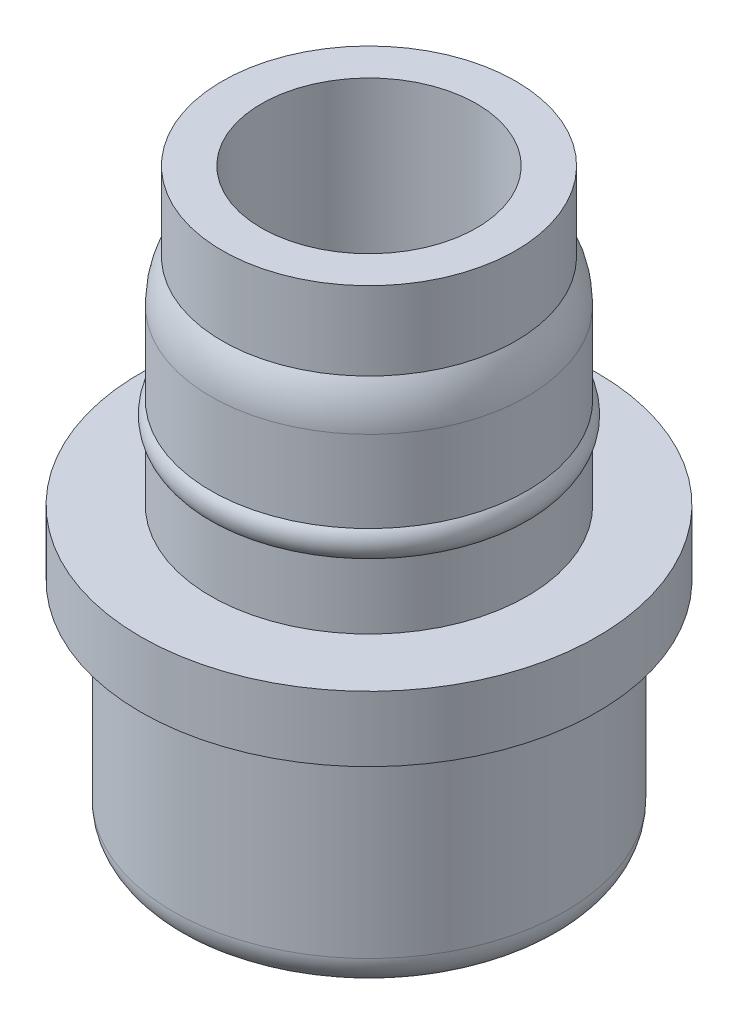
ISO-10303-21;
HEADER;
FILE_DESCRIPTION(('STEP AP214'),'2;1');
FILE_NAME('part.step','',(''),(''),'','','');
FILE_SCHEMA(('AUTOMOTIVE_DESIGN { 1 0 10303 214 1 1 1 1 }'));
ENDSEC;
DATA;
#1=APPLICATION_CONTEXT('core data for automotive mechanical design processes');
#2=APPLICATION_PROTOCOL_DEFINITION('international standard','automotive_design',2000,#1);
#3=PRODUCT_CONTEXT('',#1,'mechanical');
#4=PRODUCT('Part','Part','',(#3));
#5=PRODUCT_RELATED_PRODUCT_CATEGORY('part','',(#4));
#6=PRODUCT_DEFINITION_FORMATION('','',#4);
#7=PRODUCT_DEFINITION_CONTEXT('part definition',#1,'design');
#8=PRODUCT_DEFINITION('design','',#6,#7);
#9=PRODUCT_DEFINITION_SHAPE('','',#8);
#10=(LENGTH_UNIT() NAMED_UNIT(*) SI_UNIT(.MILLI.,.METRE.));
#11=(NAMED_UNIT(*) PLANE_ANGLE_UNIT() SI_UNIT($,.RADIAN.));
#12=(NAMED_UNIT(*) SI_UNIT($,.STERADIAN.) SOLID_ANGLE_UNIT());
#13=UNCERTAINTY_MEASURE_WITH_UNIT(LENGTH_MEASURE(1.E-05),#10,'distance_accuracy_value','');
#14=(GEOMETRIC_REPRESENTATION_CONTEXT(3) GLOBAL_UNCERTAINTY_ASSIGNED_CONTEXT((#13)) GLOBAL_UNIT_ASSIGNED_CONTEXT((#10,
#11,#12)) REPRESENTATION_CONTEXT('',''));
#15=CARTESIAN_POINT('',(0.,0.,0.));
#16=DIRECTION('',(0.,0.,1.));
#17=DIRECTION('',(1.,0.,0.));
#18=AXIS2_PLACEMENT_3D('',#15,#16,#17);
#19=CARTESIAN_POINT('',(0.,0.,0.));
#20=DIRECTION('',(0.,-1.,0.));
#21=DIRECTION('',(-1.,0.,0.));
#22=AXIS2_PLACEMENT_3D('',#19,#20,#21);
#23=SPHERICAL_SURFACE('',#22,4.5);
#24=CARTESIAN_POINT('',(0.,-1.9,0.));
#25=DIRECTION('',(0.,-1.,0.));
#26=DIRECTION('',(0.,0.,-1.));
#27=AXIS2_PLACEMENT_3D('',#24,#25,#26);
#28=CIRCLE('',#27,4.07921561087423);
#29=CARTESIAN_POINT('',(0.,-1.9,-4.07921561087423));
#30=VERTEX_POINT('',#29);
#31=EDGE_CURVE('E10',#30,#30,#28,.T.);
#32=ORIENTED_EDGE('',*,*,#31,.T.);
#33=EDGE_LOOP('',(#32));
#34=FACE_BOUND('',#33,.T.);
#35=ADVANCED_FACE('F31',(#34),#23,.T.);
#36=CARTESIAN_POINT('',(4.07921561087423,-1.9,0.));
#37=DIRECTION('',(0.,-1.,0.));
#38=DIRECTION('',(0.,0.,-1.));
#39=AXIS2_PLACEMENT_3D('',#36,#37,#38);
#40=PLANE('',#39);
#41=CARTESIAN_POINT('',(0.,-1.9,0.));
#42=DIRECTION('',(0.,-1.,0.));
#43=DIRECTION('',(0.,0.,-1.));
#44=AXIS2_PLACEMENT_3D('',#41,#42,#43);
#45=CIRCLE('',#44,5.);
#46=CARTESIAN_POINT('',(0.,-1.9,-5.));
#47=VERTEX_POINT('',#46);
#48=EDGE_CURVE('E37',#47,#47,#45,.T.);
#49=ORIENTED_EDGE('',*,*,#48,.T.);
#50=EDGE_LOOP('',(#49));
#51=FACE_BOUND('',#50,.T.);
#52=ORIENTED_EDGE('',*,*,#31,.F.);
#53=EDGE_LOOP('',(#52));
#54=FACE_BOUND('',#53,.T.);
#55=ADVANCED_FACE('F96',(#51,#54),#40,.T.);
#56=CARTESIAN_POINT('',(0.,-0.900000000000002,0.));
#57=DIRECTION('',(0.,-1.,0.));
#58=DIRECTION('',(0.,0.,-1.));
#59=AXIS2_PLACEMENT_3D('',#56,#57,#58);
#60=TOROIDAL_SURFACE('',#59,5.,1.);
#61=CARTESIAN_POINT('',(0.,-0.900000000000002,0.));
#62=DIRECTION('',(0.,-1.,0.));
#63=DIRECTION('',(0.,0.,-1.));
#64=AXIS2_PLACEMENT_3D('',#61,#62,#63);
#65=CIRCLE('',#64,6.);
#66=CARTESIAN_POINT('',(0.,-0.900000000000002,-6.));
#67=VERTEX_POINT('',#66);
#68=EDGE_CURVE('E41',#67,#67,#65,.T.);
#69=ORIENTED_EDGE('',*,*,#68,.T.);
#70=EDGE_LOOP('',(#69));
#71=FACE_BOUND('',#70,.T.);
#72=ORIENTED_EDGE('',*,*,#48,.F.);
#73=EDGE_LOOP('',(#72));
#74=FACE_BOUND('',#73,.T.);
#75=ADVANCED_FACE('F100',(#71,#74),#60,.T.);
#76=CARTESIAN_POINT('',(0.,0.,0.));
#77=DIRECTION('',(0.,-1.,0.));
#78=DIRECTION('',(0.,0.,-1.));
#79=AXIS2_PLACEMENT_3D('',#76,#77,#78);
#80=CYLINDRICAL_SURFACE('',#79,6.);
#81=CARTESIAN_POINT('',(0.,4.9,0.));
#82=DIRECTION('',(0.,-1.,0.));
#83=DIRECTION('',(0.,0.,-1.));
#84=AXIS2_PLACEMENT_3D('',#81,#82,#83);
#85=CIRCLE('',#84,6.);
#86=CARTESIAN_POINT('',(0.,4.9,-6.));
#87=VERTEX_POINT('',#86);
#88=EDGE_CURVE('E45',#87,#87,#85,.T.);
#89=ORIENTED_EDGE('',*,*,#88,.T.);
#90=EDGE_LOOP('',(#89));
#91=FACE_BOUND('',#90,.T.);
#92=ORIENTED_EDGE('',*,*,#68,.F.);
#93=EDGE_LOOP('',(#92));
#94=FACE_BOUND('',#93,.T.);
#95=ADVANCED_FACE('F104',(#91,#94),#80,.T.);
#96=CARTESIAN_POINT('',(6.,4.9,0.));
#97=DIRECTION('',(0.,-1.,0.));
#98=DIRECTION('',(0.,0.,-1.));
#99=AXIS2_PLACEMENT_3D('',#96,#97,#98);
#100=PLANE('',#99);
#101=CARTESIAN_POINT('',(0.,4.9,0.));
#102=DIRECTION('',(0.,-1.,0.));
#103=DIRECTION('',(0.,0.,-1.));
#104=AXIS2_PLACEMENT_3D('',#101,#102,#103);
#105=CIRCLE('',#104,7.);
#106=CARTESIAN_POINT('',(0.,4.9,-7.));
#107=VERTEX_POINT('',#106);
#108=EDGE_CURVE('E50',#107,#107,#105,.T.);
#109=ORIENTED_EDGE('',*,*,#108,.T.);
#110=EDGE_LOOP('',(#109));
#111=FACE_BOUND('',#110,.T.);
#112=ORIENTED_EDGE('',*,*,#88,.F.);
#113=EDGE_LOOP('',(#112));
#114=FACE_BOUND('',#113,.T.);
#115=ADVANCED_FACE('F111',(#111,#114),#100,.T.);
#116=CARTESIAN_POINT('',(0.,0.,0.));
#117=DIRECTION('',(0.,-1.,0.));
#118=DIRECTION('',(0.,0.,-1.));
#119=AXIS2_PLACEMENT_3D('',#116,#117,#118);
#120=CYLINDRICAL_SURFACE('',#119,7.);
#121=CARTESIAN_POINT('',(0.,6.9,0.));
#122=DIRECTION('',(0.,-1.,0.));
#123=DIRECTION('',(0.,0.,-1.));
#124=AXIS2_PLACEMENT_3D('',#121,#122,#123);
#125=CIRCLE('',#124,7.);
#126=CARTESIAN_POINT('',(0.,6.9,-7.));
#127=VERTEX_POINT('',#126);
#128=EDGE_CURVE('E53',#127,#127,#125,.T.);
#129=ORIENTED_EDGE('',*,*,#128,.T.);
#130=EDGE_LOOP('',(#129));
#131=FACE_BOUND('',#130,.T.);
#132=ORIENTED_EDGE('',*,*,#108,.F.);
#133=EDGE_LOOP('',(#132));
#134=FACE_BOUND('',#133,.T.);
#135=ADVANCED_FACE('F115',(#131,#134),#120,.T.);
#136=CARTESIAN_POINT('',(7.,6.9,0.));
#137=DIRECTION('',(0.,1.,0.));
#138=DIRECTION('',(0.,0.,1.));
#139=AXIS2_PLACEMENT_3D('',#136,#137,#138);
#140=PLANE('',#139);
#141=CARTESIAN_POINT('',(0.,6.9,0.));
#142=DIRECTION('',(0.,-1.,0.));
#143=DIRECTION('',(0.,0.,-1.));
#144=AXIS2_PLACEMENT_3D('',#141,#142,#143);
#145=CIRCLE('',#144,4.85);
#146=CARTESIAN_POINT('',(0.,6.9,-4.85));
#147=VERTEX_POINT('',#146);
#148=EDGE_CURVE('E56',#147,#147,#145,.T.);
#149=ORIENTED_EDGE('',*,*,#148,.T.);
#150=EDGE_LOOP('',(#149));
#151=FACE_BOUND('',#150,.T.);
#152=ORIENTED_EDGE('',*,*,#128,.F.);
#153=EDGE_LOOP('',(#152));
#154=FACE_BOUND('',#153,.T.);
#155=ADVANCED_FACE('F119',(#151,#154),#140,.T.);
#156=CARTESIAN_POINT('',(0.,0.,0.));
#157=DIRECTION('',(0.,-1.,0.));
#158=DIRECTION('',(0.,0.,-1.));
#159=AXIS2_PLACEMENT_3D('',#156,#157,#158);
#160=CYLINDRICAL_SURFACE('',#159,4.85);
#161=CARTESIAN_POINT('',(0.,8.9,0.));
#162=DIRECTION('',(0.,-1.,0.));
#163=DIRECTION('',(0.,0.,-1.));
#164=AXIS2_PLACEMENT_3D('',#161,#162,#163);
#165=CIRCLE('',#164,4.85);
#166=CARTESIAN_POINT('',(0.,8.9,-4.85));
#167=VERTEX_POINT('',#166);
#168=EDGE_CURVE('E59',#167,#167,#165,.T.);
#169=ORIENTED_EDGE('',*,*,#168,.T.);
#170=EDGE_LOOP('',(#169));
#171=FACE_BOUND('',#170,.T.);
#172=ORIENTED_EDGE('',*,*,#148,.F.);
#173=EDGE_LOOP('',(#172));
#174=FACE_BOUND('',#173,.T.);
#175=ADVANCED_FACE('F123',(#171,#174),#160,.T.);
#176=CARTESIAN_POINT('',(0.,9.3,0.));
#177=DIRECTION('',(0.,-1.,0.));
#178=DIRECTION('',(0.,0.,-1.));
#179=AXIS2_PLACEMENT_3D('',#176,#177,#178);
#180=TOROIDAL_SURFACE('',#179,4.39166666666667,0.608333333333334);
#181=CARTESIAN_POINT('',(0.,9.7,0.));
#182=DIRECTION('',(0.,-1.,0.));
#183=DIRECTION('',(0.,0.,-1.));
#184=AXIS2_PLACEMENT_3D('',#181,#182,#183);
#185=CIRCLE('',#184,4.85);
#186=CARTESIAN_POINT('',(0.,9.7,-4.85));
#187=VERTEX_POINT('',#186);
#188=EDGE_CURVE('E62',#187,#187,#185,.T.);
#189=ORIENTED_EDGE('',*,*,#188,.T.);
#190=EDGE_LOOP('',(#189));
#191=FACE_BOUND('',#190,.T.);
#192=ORIENTED_EDGE('',*,*,#168,.F.);
#193=EDGE_LOOP('',(#192));
#194=FACE_BOUND('',#193,.T.);
#195=ADVANCED_FACE('F127',(#191,#194),#180,.T.);
#196=CARTESIAN_POINT('',(0.,0.,0.));
#197=DIRECTION('',(0.,-1.,0.));
#198=DIRECTION('',(0.,0.,-1.));
#199=AXIS2_PLACEMENT_3D('',#196,#197,#198);
#200=CYLINDRICAL_SURFACE('',#199,4.85);
#201=CARTESIAN_POINT('',(0.,12.2,0.));
#202=DIRECTION('',(0.,-1.,0.));
#203=DIRECTION('',(0.,0.,-1.));
#204=AXIS2_PLACEMENT_3D('',#201,#202,#203);
#205=CIRCLE('',#204,4.85);
#206=CARTESIAN_POINT('',(0.,12.2,-4.85));
#207=VERTEX_POINT('',#206);
#208=EDGE_CURVE('E65',#207,#207,#205,.T.);
#209=ORIENTED_EDGE('',*,*,#208,.T.);
#210=EDGE_LOOP('',(#209));
#211=FACE_BOUND('',#210,.T.);
#212=ORIENTED_EDGE('',*,*,#188,.F.);
#213=EDGE_LOOP('',(#212));
#214=FACE_BOUND('',#213,.T.);
#215=ADVANCED_FACE('F131',(#211,#214),#200,.T.);
#216=CARTESIAN_POINT('',(0.,12.2,0.));
#217=DIRECTION('',(0.,-1.,0.));
#218=DIRECTION('',(0.,0.,-1.));
#219=AXIS2_PLACEMENT_3D('',#216,#217,#218);
#220=DEGENERATE_TOROIDAL_SURFACE('',#219,2.26071428571429,2.58928571428571,.T.);
#221=CARTESIAN_POINT('',(0.,13.5,0.));
#222=DIRECTION('',(0.,-1.,0.));
#223=DIRECTION('',(0.,0.,-1.));
#224=AXIS2_PLACEMENT_3D('',#221,#222,#223);
#225=CIRCLE('',#224,4.5);
#226=CARTESIAN_POINT('',(0.,13.5,-4.5));
#227=VERTEX_POINT('',#226);
#228=EDGE_CURVE('E68',#227,#227,#225,.T.);
#229=ORIENTED_EDGE('',*,*,#228,.T.);
#230=EDGE_LOOP('',(#229));
#231=FACE_BOUND('',#230,.T.);
#232=ORIENTED_EDGE('',*,*,#208,.F.);
#233=EDGE_LOOP('',(#232));
#234=FACE_BOUND('',#233,.T.);
#235=ADVANCED_FACE('F135',(#231,#234),#220,.T.);
#236=CARTESIAN_POINT('',(0.,0.,0.));
#237=DIRECTION('',(0.,-1.,0.));
#238=DIRECTION('',(0.,0.,-1.));
#239=AXIS2_PLACEMENT_3D('',#236,#237,#238);
#240=CYLINDRICAL_SURFACE('',#239,4.5);
#241=CARTESIAN_POINT('',(0.,15.9,0.));
#242=DIRECTION('',(0.,-1.,0.));
#243=DIRECTION('',(0.,0.,-1.));
#244=AXIS2_PLACEMENT_3D('',#241,#242,#243);
#245=CIRCLE('',#244,4.5);
#246=CARTESIAN_POINT('',(0.,15.9,-4.5));
#247=VERTEX_POINT('',#246);
#248=EDGE_CURVE('E71',#247,#247,#245,.T.);
#249=ORIENTED_EDGE('',*,*,#248,.T.);
#250=EDGE_LOOP('',(#249));
#251=FACE_BOUND('',#250,.T.);
#252=ORIENTED_EDGE('',*,*,#228,.F.);
#253=EDGE_LOOP('',(#252));
#254=FACE_BOUND('',#253,.T.);
#255=ADVANCED_FACE('F139',(#251,#254),#240,.T.);
#256=CARTESIAN_POINT('',(4.5,15.9,0.));
#257=DIRECTION('',(0.,1.,0.));
#258=DIRECTION('',(0.,0.,1.));
#259=AXIS2_PLACEMENT_3D('',#256,#257,#258);
#260=PLANE('',#259);
#261=CARTESIAN_POINT('',(0.,15.9,0.));
#262=DIRECTION('',(0.,-1.,0.));
#263=DIRECTION('',(0.,0.,-1.));
#264=AXIS2_PLACEMENT_3D('',#261,#262,#263);
#265=CIRCLE('',#264,3.3);
#266=CARTESIAN_POINT('',(0.,15.9,-3.3));
#267=VERTEX_POINT('',#266);
#268=EDGE_CURVE('E74',#267,#267,#265,.T.);
#269=ORIENTED_EDGE('',*,*,#268,.T.);
#270=EDGE_LOOP('',(#269));
#271=FACE_BOUND('',#270,.T.);
#272=ORIENTED_EDGE('',*,*,#248,.F.);
#273=EDGE_LOOP('',(#272));
#274=FACE_BOUND('',#273,.T.);
#275=ADVANCED_FACE('F143',(#271,#274),#260,.T.);
#276=CARTESIAN_POINT('',(0.,0.,0.));
#277=DIRECTION('',(0.,-1.,0.));
#278=DIRECTION('',(0.,0.,-1.));
#279=AXIS2_PLACEMENT_3D('',#276,#277,#278);
#280=CYLINDRICAL_SURFACE('',#279,3.3);
#281=CARTESIAN_POINT('',(0.,4.2,0.));
#282=DIRECTION('',(0.,-1.,0.));
#283=DIRECTION('',(0.,0.,-1.));
#284=AXIS2_PLACEMENT_3D('',#281,#282,#283);
#285=CIRCLE('',#284,3.3);
#286=CARTESIAN_POINT('',(0.,4.2,-3.3));
#287=VERTEX_POINT('',#286);
#288=EDGE_CURVE('E77',#287,#287,#285,.T.);
#289=ORIENTED_EDGE('',*,*,#288,.T.);
#290=EDGE_LOOP('',(#289));
#291=FACE_BOUND('',#290,.T.);
#292=ORIENTED_EDGE('',*,*,#268,.F.);
#293=EDGE_LOOP('',(#292));
#294=FACE_BOUND('',#293,.T.);
#295=ADVANCED_FACE('F93',(#291,#294),#280,.F.);
#296=CARTESIAN_POINT('',(1.61554944214036,4.2,0.));
#297=DIRECTION('',(0.,1.,0.));
#298=DIRECTION('',(0.,0.,1.));
#299=AXIS2_PLACEMENT_3D('',#296,#297,#298);
#300=PLANE('',#299);
#301=CARTESIAN_POINT('',(0.,4.2,0.));
#302=DIRECTION('',(0.,-1.,0.));
#303=DIRECTION('',(0.,0.,-1.));
#304=AXIS2_PLACEMENT_3D('',#301,#302,#303);
#305=CIRCLE('',#304,1.61554944214036);
#306=CARTESIAN_POINT('',(0.,4.2,-1.61554944214036));
#307=VERTEX_POINT('',#306);
#308=EDGE_CURVE('E80',#307,#307,#305,.T.);
#309=ORIENTED_EDGE('',*,*,#308,.T.);
#310=EDGE_LOOP('',(#309));
#311=FACE_BOUND('',#310,.T.);
#312=ORIENTED_EDGE('',*,*,#288,.F.);
#313=EDGE_LOOP('',(#312));
#314=FACE_BOUND('',#313,.T.);
#315=ADVANCED_FACE('F84',(#311,#314),#300,.T.);
#316=CARTESIAN_POINT('',(0.,0.,0.));
#317=DIRECTION('',(0.,-1.,0.));
#318=DIRECTION('',(1.,0.,0.));
#319=AXIS2_PLACEMENT_3D('',#316,#317,#318);
#320=SPHERICAL_SURFACE('',#319,4.5);
#321=ORIENTED_EDGE('',*,*,#308,.F.);
#322=EDGE_LOOP('',(#321));
#323=FACE_BOUND('',#322,.T.);
#324=ADVANCED_FACE('F87',(#323),#320,.T.);
#325=CLOSED_SHELL('',(#35,#55,#75,#95,#115,#135,#155,#175,#195,#215,#235,#255,#275,#295,#315,#324));
#326=MANIFOLD_SOLID_BREP('B2',#325);
#327=ADVANCED_BREP_SHAPE_REPRESENTATION('',(#18,#326),#14);
#328=SHAPE_DEFINITION_REPRESENTATION(#9,#327);
ENDSEC;
END-ISO-10303-21;
